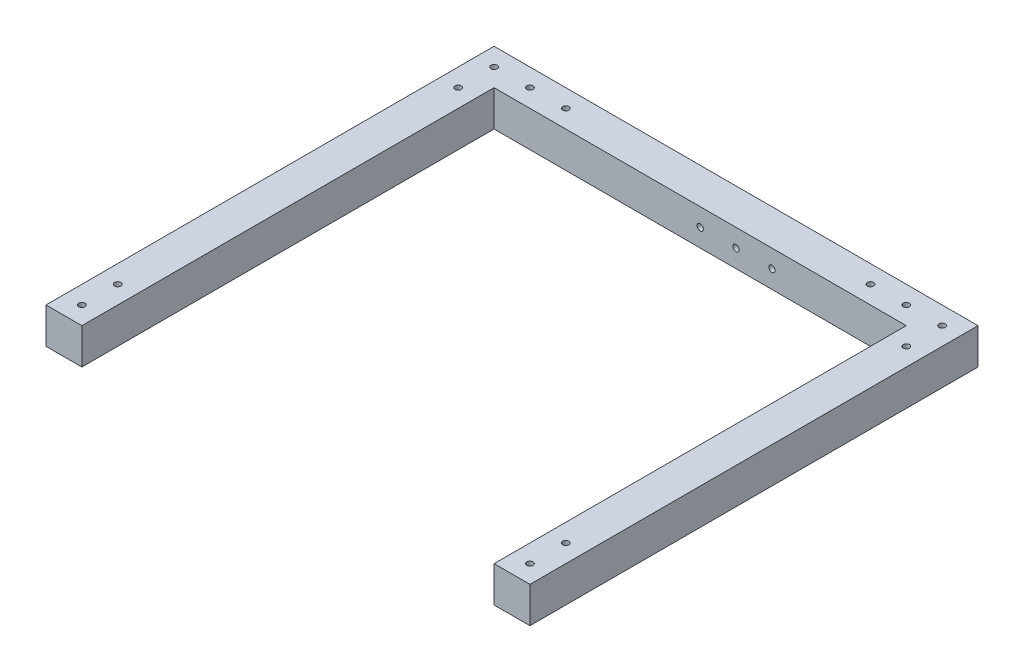
ISO-10303-21;
HEADER;
FILE_DESCRIPTION(('STEP AP214'),'2;1');
FILE_NAME('part.step','',(''),(''),'','','');
FILE_SCHEMA(('AUTOMOTIVE_DESIGN { 1 0 10303 214 1 1 1 1 }'));
ENDSEC;
DATA;
#1=APPLICATION_CONTEXT('core data for automotive mechanical design processes');
#2=APPLICATION_PROTOCOL_DEFINITION('international standard','automotive_design',2000,#1);
#3=PRODUCT_CONTEXT('',#1,'mechanical');
#4=PRODUCT('Part','Part','',(#3));
#5=PRODUCT_RELATED_PRODUCT_CATEGORY('part','',(#4));
#6=PRODUCT_DEFINITION_FORMATION('','',#4);
#7=PRODUCT_DEFINITION_CONTEXT('part definition',#1,'design');
#8=PRODUCT_DEFINITION('design','',#6,#7);
#9=PRODUCT_DEFINITION_SHAPE('','',#8);
#10=(LENGTH_UNIT() NAMED_UNIT(*) SI_UNIT(.MILLI.,.METRE.));
#11=(NAMED_UNIT(*) PLANE_ANGLE_UNIT() SI_UNIT($,.RADIAN.));
#12=(NAMED_UNIT(*) SI_UNIT($,.STERADIAN.) SOLID_ANGLE_UNIT());
#13=UNCERTAINTY_MEASURE_WITH_UNIT(LENGTH_MEASURE(1.E-05),#10,'distance_accuracy_value','');
#14=(GEOMETRIC_REPRESENTATION_CONTEXT(3) GLOBAL_UNCERTAINTY_ASSIGNED_CONTEXT((#13)) GLOBAL_UNIT_ASSIGNED_CONTEXT((#10,
#11,#12)) REPRESENTATION_CONTEXT('',''));
#15=CARTESIAN_POINT('',(0.,0.,0.));
#16=DIRECTION('',(0.,0.,1.));
#17=DIRECTION('',(1.,0.,0.));
#18=AXIS2_PLACEMENT_3D('',#15,#16,#17);
#19=CARTESIAN_POINT('',(0.,20.,0.));
#20=DIRECTION('',(0.,1.,0.));
#21=DIRECTION('',(0.,0.,1.));
#22=AXIS2_PLACEMENT_3D('',#19,#20,#21);
#23=PLANE('',#22);
#24=CARTESIAN_POINT('',(-125.,20.,20.));
#25=DIRECTION('',(0.,1.,0.));
#26=DIRECTION('',(0.,0.,1.));
#27=AXIS2_PLACEMENT_3D('',#24,#25,#26);
#28=CIRCLE('',#27,1.75000000000001);
#29=CARTESIAN_POINT('',(-125.,20.,21.75));
#30=VERTEX_POINT('',#29);
#31=EDGE_CURVE('E338',#30,#30,#28,.T.);
#32=ORIENTED_EDGE('',*,*,#31,.F.);
#33=EDGE_LOOP('',(#32));
#34=FACE_BOUND('',#33,.T.);
#35=CARTESIAN_POINT('',(-105.,20.,0.));
#36=DIRECTION('',(0.,1.,0.));
#37=DIRECTION('',(0.,0.,1.));
#38=AXIS2_PLACEMENT_3D('',#35,#36,#37);
#39=CIRCLE('',#38,1.75);
#40=CARTESIAN_POINT('',(-105.,20.,1.74999999999999));
#41=VERTEX_POINT('',#40);
#42=EDGE_CURVE('E337',#41,#41,#39,.T.);
#43=ORIENTED_EDGE('',*,*,#42,.F.);
#44=EDGE_LOOP('',(#43));
#45=FACE_BOUND('',#44,.T.);
#46=CARTESIAN_POINT('',(-125.,20.,210.));
#47=DIRECTION('',(0.,1.,0.));
#48=DIRECTION('',(0.,0.,1.));
#49=AXIS2_PLACEMENT_3D('',#46,#47,#48);
#50=CIRCLE('',#49,1.75000000000001);
#51=CARTESIAN_POINT('',(-125.,20.,211.75));
#52=VERTEX_POINT('',#51);
#53=EDGE_CURVE('E349',#52,#52,#50,.T.);
#54=ORIENTED_EDGE('',*,*,#53,.F.);
#55=EDGE_LOOP('',(#54));
#56=FACE_BOUND('',#55,.T.);
#57=CARTESIAN_POINT('',(-125.,20.,230.));
#58=DIRECTION('',(0.,1.,0.));
#59=DIRECTION('',(0.,0.,1.));
#60=AXIS2_PLACEMENT_3D('',#57,#58,#59);
#61=CIRCLE('',#60,1.75000000000001);
#62=CARTESIAN_POINT('',(-125.,20.,231.75));
#63=VERTEX_POINT('',#62);
#64=EDGE_CURVE('E360',#63,#63,#61,.T.);
#65=ORIENTED_EDGE('',*,*,#64,.F.);
#66=EDGE_LOOP('',(#65));
#67=FACE_BOUND('',#66,.T.);
#68=CARTESIAN_POINT('',(125.,20.,230.));
#69=DIRECTION('',(0.,1.,0.));
#70=DIRECTION('',(0.,0.,1.));
#71=AXIS2_PLACEMENT_3D('',#68,#69,#70);
#72=CIRCLE('',#71,1.75000000000001);
#73=CARTESIAN_POINT('',(125.,20.,231.75));
#74=VERTEX_POINT('',#73);
#75=EDGE_CURVE('E379',#74,#74,#72,.F.);
#76=ORIENTED_EDGE('',*,*,#75,.T.);
#77=EDGE_LOOP('',(#76));
#78=FACE_BOUND('',#77,.T.);
#79=CARTESIAN_POINT('',(125.,20.,20.));
#80=DIRECTION('',(0.,1.,0.));
#81=DIRECTION('',(0.,0.,1.));
#82=AXIS2_PLACEMENT_3D('',#79,#80,#81);
#83=CIRCLE('',#82,1.75000000000001);
#84=CARTESIAN_POINT('',(125.,20.,21.75));
#85=VERTEX_POINT('',#84);
#86=EDGE_CURVE('E312',#85,#85,#83,.F.);
#87=ORIENTED_EDGE('',*,*,#86,.T.);
#88=EDGE_LOOP('',(#87));
#89=FACE_BOUND('',#88,.T.);
#90=CARTESIAN_POINT('',(85.0000000000001,20.,0.));
#91=DIRECTION('',(0.,1.,0.));
#92=DIRECTION('',(0.,0.,1.));
#93=AXIS2_PLACEMENT_3D('',#90,#91,#92);
#94=CIRCLE('',#93,1.75);
#95=CARTESIAN_POINT('',(85.0000000000001,20.,1.74999999999997));
#96=VERTEX_POINT('',#95);
#97=EDGE_CURVE('E322',#96,#96,#94,.F.);
#98=ORIENTED_EDGE('',*,*,#97,.T.);
#99=EDGE_LOOP('',(#98));
#100=FACE_BOUND('',#99,.T.);
#101=CARTESIAN_POINT('',(-85.0000000000001,20.,0.));
#102=DIRECTION('',(0.,1.,0.));
#103=DIRECTION('',(0.,0.,1.));
#104=AXIS2_PLACEMENT_3D('',#101,#102,#103);
#105=CIRCLE('',#104,1.75);
#106=CARTESIAN_POINT('',(-85.0000000000001,20.,1.74999999999999));
#107=VERTEX_POINT('',#106);
#108=EDGE_CURVE('E327',#107,#107,#105,.T.);
#109=ORIENTED_EDGE('',*,*,#108,.F.);
#110=EDGE_LOOP('',(#109));
#111=FACE_BOUND('',#110,.T.);
#112=CARTESIAN_POINT('',(-125.,20.,0.));
#113=DIRECTION('',(0.,1.,0.));
#114=DIRECTION('',(0.,0.,1.));
#115=AXIS2_PLACEMENT_3D('',#112,#113,#114);
#116=CIRCLE('',#115,1.75000000000001);
#117=CARTESIAN_POINT('',(-125.,20.,1.75));
#118=VERTEX_POINT('',#117);
#119=EDGE_CURVE('E342',#118,#118,#116,.T.);
#120=ORIENTED_EDGE('',*,*,#119,.F.);
#121=EDGE_LOOP('',(#120));
#122=FACE_BOUND('',#121,.T.);
#123=DIRECTION('',(0.,0.,1.));
#124=VECTOR('',#123,1.);
#125=CARTESIAN_POINT('',(135.,20.,-3.7470027081099E-13));
#126=LINE('',#125,#124);
#127=CARTESIAN_POINT('',(135.,20.,-10.));
#128=VERTEX_POINT('',#127);
#129=CARTESIAN_POINT('',(135.,20.,240.));
#130=VERTEX_POINT('',#129);
#131=EDGE_CURVE('E171',#128,#130,#126,.T.);
#132=ORIENTED_EDGE('',*,*,#131,.F.);
#133=DIRECTION('',(1.,0.,0.));
#134=VECTOR('',#133,1.);
#135=CARTESIAN_POINT('',(0.,20.,-10.));
#136=LINE('',#135,#134);
#137=CARTESIAN_POINT('',(-135.,20.,-10.));
#138=VERTEX_POINT('',#137);
#139=EDGE_CURVE('E203',#138,#128,#136,.T.);
#140=ORIENTED_EDGE('',*,*,#139,.F.);
#141=DIRECTION('',(0.,0.,1.));
#142=VECTOR('',#141,1.);
#143=CARTESIAN_POINT('',(-135.,20.,0.));
#144=LINE('',#143,#142);
#145=CARTESIAN_POINT('',(-135.,20.,240.));
#146=VERTEX_POINT('',#145);
#147=EDGE_CURVE('E193',#138,#146,#144,.T.);
#148=ORIENTED_EDGE('',*,*,#147,.T.);
#149=DIRECTION('',(1.,0.,0.));
#150=VECTOR('',#149,1.);
#151=CARTESIAN_POINT('',(0.,20.,240.));
#152=LINE('',#151,#150);
#153=CARTESIAN_POINT('',(-115.,20.,240.));
#154=VERTEX_POINT('',#153);
#155=EDGE_CURVE('E413',#146,#154,#152,.T.);
#156=ORIENTED_EDGE('',*,*,#155,.T.);
#157=DIRECTION('',(0.,0.,1.));
#158=VECTOR('',#157,1.);
#159=CARTESIAN_POINT('',(-115.,20.,0.));
#160=LINE('',#159,#158);
#161=CARTESIAN_POINT('',(-115.,20.,10.));
#162=VERTEX_POINT('',#161);
#163=EDGE_CURVE('E125',#162,#154,#160,.T.);
#164=ORIENTED_EDGE('',*,*,#163,.F.);
#165=DIRECTION('',(1.,0.,0.));
#166=VECTOR('',#165,1.);
#167=CARTESIAN_POINT('',(0.,20.,10.));
#168=LINE('',#167,#166);
#169=CARTESIAN_POINT('',(115.,20.,9.99999999999999));
#170=VERTEX_POINT('',#169);
#171=EDGE_CURVE('E113',#162,#170,#168,.T.);
#172=ORIENTED_EDGE('',*,*,#171,.T.);
#173=DIRECTION('',(0.,0.,1.));
#174=VECTOR('',#173,1.);
#175=CARTESIAN_POINT('',(115.,20.,0.));
#176=LINE('',#175,#174);
#177=CARTESIAN_POINT('',(115.,20.,240.));
#178=VERTEX_POINT('',#177);
#179=EDGE_CURVE('E117',#170,#178,#176,.T.);
#180=ORIENTED_EDGE('',*,*,#179,.T.);
#181=DIRECTION('',(-1.,0.,0.));
#182=VECTOR('',#181,1.);
#183=CARTESIAN_POINT('',(-3.33066907387547E-13,20.,240.));
#184=LINE('',#183,#182);
#185=EDGE_CURVE('E136',#130,#178,#184,.T.);
#186=ORIENTED_EDGE('',*,*,#185,.F.);
#187=EDGE_LOOP('',(#132,#140,#148,#156,#164,#172,#180,#186));
#188=FACE_BOUND('',#187,.T.);
#189=CARTESIAN_POINT('',(105.,20.,0.));
#190=DIRECTION('',(0.,1.,0.));
#191=DIRECTION('',(0.,0.,1.));
#192=AXIS2_PLACEMENT_3D('',#189,#190,#191);
#193=CIRCLE('',#192,1.75);
#194=CARTESIAN_POINT('',(105.,20.,1.74999999999996));
#195=VERTEX_POINT('',#194);
#196=EDGE_CURVE('E316',#195,#195,#193,.F.);
#197=ORIENTED_EDGE('',*,*,#196,.T.);
#198=EDGE_LOOP('',(#197));
#199=FACE_BOUND('',#198,.T.);
#200=CARTESIAN_POINT('',(125.,20.,0.));
#201=DIRECTION('',(0.,1.,0.));
#202=DIRECTION('',(0.,0.,1.));
#203=AXIS2_PLACEMENT_3D('',#200,#201,#202);
#204=CIRCLE('',#203,1.75000000000001);
#205=CARTESIAN_POINT('',(125.,20.,1.74999999999997));
#206=VERTEX_POINT('',#205);
#207=EDGE_CURVE('E389',#206,#206,#204,.F.);
#208=ORIENTED_EDGE('',*,*,#207,.T.);
#209=EDGE_LOOP('',(#208));
#210=FACE_BOUND('',#209,.T.);
#211=CARTESIAN_POINT('',(125.,20.,210.));
#212=DIRECTION('',(0.,1.,0.));
#213=DIRECTION('',(0.,0.,1.));
#214=AXIS2_PLACEMENT_3D('',#211,#212,#213);
#215=CIRCLE('',#214,1.75000000000001);
#216=CARTESIAN_POINT('',(125.,20.,211.75));
#217=VERTEX_POINT('',#216);
#218=EDGE_CURVE('E375',#217,#217,#215,.F.);
#219=ORIENTED_EDGE('',*,*,#218,.T.);
#220=EDGE_LOOP('',(#219));
#221=FACE_BOUND('',#220,.T.);
#222=ADVANCED_FACE('F46',(#34,#45,#56,#67,#78,#89,#100,#111,#122,#188,#199,#210,#221),#23,.T.);
#223=CARTESIAN_POINT('',(0.,0.,0.));
#224=DIRECTION('',(0.,1.,0.));
#225=DIRECTION('',(0.,0.,1.));
#226=AXIS2_PLACEMENT_3D('',#223,#224,#225);
#227=PLANE('',#226);
#228=CARTESIAN_POINT('',(-125.,0.,20.));
#229=DIRECTION('',(0.,1.,0.));
#230=DIRECTION('',(0.,0.,1.));
#231=AXIS2_PLACEMENT_3D('',#228,#229,#230);
#232=CIRCLE('',#231,1.75000000000001);
#233=CARTESIAN_POINT('',(-125.,0.,21.75));
#234=VERTEX_POINT('',#233);
#235=EDGE_CURVE('E333',#234,#234,#232,.F.);
#236=ORIENTED_EDGE('',*,*,#235,.F.);
#237=EDGE_LOOP('',(#236));
#238=FACE_BOUND('',#237,.T.);
#239=CARTESIAN_POINT('',(-105.,0.,0.));
#240=DIRECTION('',(0.,1.,0.));
#241=DIRECTION('',(0.,0.,1.));
#242=AXIS2_PLACEMENT_3D('',#239,#240,#241);
#243=CIRCLE('',#242,1.75);
#244=CARTESIAN_POINT('',(-105.,0.,1.74999999999999));
#245=VERTEX_POINT('',#244);
#246=EDGE_CURVE('E344',#245,#245,#243,.F.);
#247=ORIENTED_EDGE('',*,*,#246,.F.);
#248=EDGE_LOOP('',(#247));
#249=FACE_BOUND('',#248,.T.);
#250=CARTESIAN_POINT('',(-125.,0.,210.));
#251=DIRECTION('',(0.,1.,0.));
#252=DIRECTION('',(0.,0.,1.));
#253=AXIS2_PLACEMENT_3D('',#250,#251,#252);
#254=CIRCLE('',#253,1.75000000000001);
#255=CARTESIAN_POINT('',(-125.,0.,211.75));
#256=VERTEX_POINT('',#255);
#257=EDGE_CURVE('E355',#256,#256,#254,.F.);
#258=ORIENTED_EDGE('',*,*,#257,.F.);
#259=EDGE_LOOP('',(#258));
#260=FACE_BOUND('',#259,.T.);
#261=CARTESIAN_POINT('',(-125.,0.,230.));
#262=DIRECTION('',(0.,1.,0.));
#263=DIRECTION('',(0.,0.,1.));
#264=AXIS2_PLACEMENT_3D('',#261,#262,#263);
#265=CIRCLE('',#264,1.75000000000001);
#266=CARTESIAN_POINT('',(-125.,0.,231.75));
#267=VERTEX_POINT('',#266);
#268=EDGE_CURVE('E363',#267,#267,#265,.F.);
#269=ORIENTED_EDGE('',*,*,#268,.F.);
#270=EDGE_LOOP('',(#269));
#271=FACE_BOUND('',#270,.T.);
#272=CARTESIAN_POINT('',(-85.0000000000001,0.,0.));
#273=DIRECTION('',(0.,1.,0.));
#274=DIRECTION('',(0.,0.,1.));
#275=AXIS2_PLACEMENT_3D('',#272,#273,#274);
#276=CIRCLE('',#275,1.75);
#277=CARTESIAN_POINT('',(-85.0000000000001,0.,1.74999999999999));
#278=VERTEX_POINT('',#277);
#279=EDGE_CURVE('E309',#278,#278,#276,.F.);
#280=ORIENTED_EDGE('',*,*,#279,.F.);
#281=EDGE_LOOP('',(#280));
#282=FACE_BOUND('',#281,.T.);
#283=CARTESIAN_POINT('',(-125.,0.,0.));
#284=DIRECTION('',(0.,1.,0.));
#285=DIRECTION('',(0.,0.,1.));
#286=AXIS2_PLACEMENT_3D('',#283,#284,#285);
#287=CIRCLE('',#286,1.75000000000001);
#288=CARTESIAN_POINT('',(-125.,0.,1.75));
#289=VERTEX_POINT('',#288);
#290=EDGE_CURVE('E146',#289,#289,#287,.F.);
#291=ORIENTED_EDGE('',*,*,#290,.F.);
#292=EDGE_LOOP('',(#291));
#293=FACE_BOUND('',#292,.T.);
#294=DIRECTION('',(0.,0.,1.));
#295=VECTOR('',#294,1.);
#296=CARTESIAN_POINT('',(135.,0.,-3.7470027081099E-13));
#297=LINE('',#296,#295);
#298=CARTESIAN_POINT('',(135.,0.,-10.));
#299=VERTEX_POINT('',#298);
#300=CARTESIAN_POINT('',(135.,0.,240.));
#301=VERTEX_POINT('',#300);
#302=EDGE_CURVE('E145',#299,#301,#297,.T.);
#303=ORIENTED_EDGE('',*,*,#302,.T.);
#304=DIRECTION('',(-1.,0.,0.));
#305=VECTOR('',#304,1.);
#306=CARTESIAN_POINT('',(-3.33066907387547E-13,0.,240.));
#307=LINE('',#306,#305);
#308=CARTESIAN_POINT('',(115.,0.,240.));
#309=VERTEX_POINT('',#308);
#310=EDGE_CURVE('E169',#301,#309,#307,.T.);
#311=ORIENTED_EDGE('',*,*,#310,.T.);
#312=DIRECTION('',(0.,0.,1.));
#313=VECTOR('',#312,1.);
#314=CARTESIAN_POINT('',(115.,0.,0.));
#315=LINE('',#314,#313);
#316=CARTESIAN_POINT('',(115.,0.,9.99999999999999));
#317=VERTEX_POINT('',#316);
#318=EDGE_CURVE('E164',#317,#309,#315,.T.);
#319=ORIENTED_EDGE('',*,*,#318,.F.);
#320=DIRECTION('',(1.,0.,0.));
#321=VECTOR('',#320,1.);
#322=CARTESIAN_POINT('',(0.,0.,10.));
#323=LINE('',#322,#321);
#324=CARTESIAN_POINT('',(-115.,0.,10.));
#325=VERTEX_POINT('',#324);
#326=EDGE_CURVE('E128',#325,#317,#323,.T.);
#327=ORIENTED_EDGE('',*,*,#326,.F.);
#328=DIRECTION('',(0.,0.,1.));
#329=VECTOR('',#328,1.);
#330=CARTESIAN_POINT('',(-115.,0.,0.));
#331=LINE('',#330,#329);
#332=CARTESIAN_POINT('',(-115.,0.,240.));
#333=VERTEX_POINT('',#332);
#334=EDGE_CURVE('E157',#325,#333,#331,.T.);
#335=ORIENTED_EDGE('',*,*,#334,.T.);
#336=DIRECTION('',(1.,0.,0.));
#337=VECTOR('',#336,1.);
#338=CARTESIAN_POINT('',(0.,0.,240.));
#339=LINE('',#338,#337);
#340=CARTESIAN_POINT('',(-135.,0.,240.));
#341=VERTEX_POINT('',#340);
#342=EDGE_CURVE('E154',#341,#333,#339,.T.);
#343=ORIENTED_EDGE('',*,*,#342,.F.);
#344=DIRECTION('',(0.,0.,1.));
#345=VECTOR('',#344,1.);
#346=CARTESIAN_POINT('',(-135.,0.,0.));
#347=LINE('',#346,#345);
#348=CARTESIAN_POINT('',(-135.,0.,-10.));
#349=VERTEX_POINT('',#348);
#350=EDGE_CURVE('E155',#349,#341,#347,.T.);
#351=ORIENTED_EDGE('',*,*,#350,.F.);
#352=DIRECTION('',(1.,0.,0.));
#353=VECTOR('',#352,1.);
#354=CARTESIAN_POINT('',(0.,0.,-10.));
#355=LINE('',#354,#353);
#356=EDGE_CURVE('E150',#349,#299,#355,.T.);
#357=ORIENTED_EDGE('',*,*,#356,.T.);
#358=EDGE_LOOP('',(#303,#311,#319,#327,#335,#343,#351,#357));
#359=FACE_BOUND('',#358,.T.);
#360=CARTESIAN_POINT('',(85.0000000000001,0.,0.));
#361=DIRECTION('',(0.,1.,0.));
#362=DIRECTION('',(0.,0.,1.));
#363=AXIS2_PLACEMENT_3D('',#360,#361,#362);
#364=CIRCLE('',#363,1.75);
#365=CARTESIAN_POINT('',(85.0000000000001,0.,1.74999999999997));
#366=VERTEX_POINT('',#365);
#367=EDGE_CURVE('E319',#366,#366,#364,.T.);
#368=ORIENTED_EDGE('',*,*,#367,.T.);
#369=EDGE_LOOP('',(#368));
#370=FACE_BOUND('',#369,.T.);
#371=CARTESIAN_POINT('',(105.,0.,0.));
#372=DIRECTION('',(0.,1.,0.));
#373=DIRECTION('',(0.,0.,1.));
#374=AXIS2_PLACEMENT_3D('',#371,#372,#373);
#375=CIRCLE('',#374,1.75);
#376=CARTESIAN_POINT('',(105.,0.,1.74999999999996));
#377=VERTEX_POINT('',#376);
#378=EDGE_CURVE('E313',#377,#377,#375,.T.);
#379=ORIENTED_EDGE('',*,*,#378,.T.);
#380=EDGE_LOOP('',(#379));
#381=FACE_BOUND('',#380,.T.);
#382=CARTESIAN_POINT('',(125.,0.,20.));
#383=DIRECTION('',(0.,1.,0.));
#384=DIRECTION('',(0.,0.,1.));
#385=AXIS2_PLACEMENT_3D('',#382,#383,#384);
#386=CIRCLE('',#385,1.75000000000001);
#387=CARTESIAN_POINT('',(125.,0.,21.75));
#388=VERTEX_POINT('',#387);
#389=EDGE_CURVE('E391',#388,#388,#386,.T.);
#390=ORIENTED_EDGE('',*,*,#389,.T.);
#391=EDGE_LOOP('',(#390));
#392=FACE_BOUND('',#391,.T.);
#393=CARTESIAN_POINT('',(125.,0.,0.));
#394=DIRECTION('',(0.,1.,0.));
#395=DIRECTION('',(0.,0.,1.));
#396=AXIS2_PLACEMENT_3D('',#393,#394,#395);
#397=CIRCLE('',#396,1.75000000000001);
#398=CARTESIAN_POINT('',(125.,0.,1.74999999999997));
#399=VERTEX_POINT('',#398);
#400=EDGE_CURVE('E383',#399,#399,#397,.T.);
#401=ORIENTED_EDGE('',*,*,#400,.T.);
#402=EDGE_LOOP('',(#401));
#403=FACE_BOUND('',#402,.T.);
#404=CARTESIAN_POINT('',(125.,0.,230.));
#405=DIRECTION('',(0.,1.,0.));
#406=DIRECTION('',(0.,0.,1.));
#407=AXIS2_PLACEMENT_3D('',#404,#405,#406);
#408=CIRCLE('',#407,1.75000000000001);
#409=CARTESIAN_POINT('',(125.,0.,231.75));
#410=VERTEX_POINT('',#409);
#411=EDGE_CURVE('E376',#410,#410,#408,.T.);
#412=ORIENTED_EDGE('',*,*,#411,.T.);
#413=EDGE_LOOP('',(#412));
#414=FACE_BOUND('',#413,.T.);
#415=CARTESIAN_POINT('',(125.,0.,210.));
#416=DIRECTION('',(0.,1.,0.));
#417=DIRECTION('',(0.,0.,1.));
#418=AXIS2_PLACEMENT_3D('',#415,#416,#417);
#419=CIRCLE('',#418,1.75000000000001);
#420=CARTESIAN_POINT('',(125.,0.,211.75));
#421=VERTEX_POINT('',#420);
#422=EDGE_CURVE('E364',#421,#421,#419,.T.);
#423=ORIENTED_EDGE('',*,*,#422,.T.);
#424=EDGE_LOOP('',(#423));
#425=FACE_BOUND('',#424,.T.);
#426=ADVANCED_FACE('F196',(#238,#249,#260,#271,#282,#293,#359,#370,#381,#392,#403,#414,#425),
#227,.F.);
#427=CARTESIAN_POINT('',(135.,20.,-3.7470027081099E-13));
#428=DIRECTION('',(1.,0.,0.));
#429=DIRECTION('',(0.,0.,-1.));
#430=AXIS2_PLACEMENT_3D('',#427,#428,#429);
#431=PLANE('',#430);
#432=ORIENTED_EDGE('',*,*,#302,.F.);
#433=DIRECTION('',(0.,-1.,0.));
#434=VECTOR('',#433,1.);
#435=CARTESIAN_POINT('',(135.,20.,-10.));
#436=LINE('',#435,#434);
#437=EDGE_CURVE('E11',#128,#299,#436,.T.);
#438=ORIENTED_EDGE('',*,*,#437,.F.);
#439=ORIENTED_EDGE('',*,*,#131,.T.);
#440=DIRECTION('',(0.,-1.,0.));
#441=VECTOR('',#440,1.);
#442=CARTESIAN_POINT('',(135.,20.,240.));
#443=LINE('',#442,#441);
#444=EDGE_CURVE('E63',#130,#301,#443,.T.);
#445=ORIENTED_EDGE('',*,*,#444,.T.);
#446=EDGE_LOOP('',(#432,#438,#439,#445));
#447=FACE_BOUND('',#446,.T.);
#448=ADVANCED_FACE('F48',(#447),#431,.T.);
#449=CARTESIAN_POINT('',(0.,20.,-10.));
#450=DIRECTION('',(0.,0.,-1.));
#451=DIRECTION('',(-1.,0.,0.));
#452=AXIS2_PLACEMENT_3D('',#449,#450,#451);
#453=PLANE('',#452);
#454=CARTESIAN_POINT('',(40.,10.,-10.));
#455=DIRECTION('',(0.,0.,-1.));
#456=DIRECTION('',(-1.,0.,0.));
#457=AXIS2_PLACEMENT_3D('',#454,#455,#456);
#458=CIRCLE('',#457,1.75);
#459=CARTESIAN_POINT('',(38.25,10.,-10.));
#460=VERTEX_POINT('',#459);
#461=EDGE_CURVE('E289',#460,#460,#458,.T.);
#462=ORIENTED_EDGE('',*,*,#461,.F.);
#463=EDGE_LOOP('',(#462));
#464=FACE_BOUND('',#463,.T.);
#465=CARTESIAN_POINT('',(0.,10.,-10.));
#466=DIRECTION('',(0.,0.,-1.));
#467=DIRECTION('',(-1.,0.,0.));
#468=AXIS2_PLACEMENT_3D('',#465,#466,#467);
#469=CIRCLE('',#468,1.75);
#470=CARTESIAN_POINT('',(-1.75,10.,-10.));
#471=VERTEX_POINT('',#470);
#472=EDGE_CURVE('E283',#471,#471,#469,.T.);
#473=ORIENTED_EDGE('',*,*,#472,.F.);
#474=EDGE_LOOP('',(#473));
#475=FACE_BOUND('',#474,.T.);
#476=CARTESIAN_POINT('',(20.,10.,-10.));
#477=DIRECTION('',(0.,0.,-1.));
#478=DIRECTION('',(-1.,0.,0.));
#479=AXIS2_PLACEMENT_3D('',#476,#477,#478);
#480=CIRCLE('',#479,1.75);
#481=CARTESIAN_POINT('',(18.25,10.,-10.));
#482=VERTEX_POINT('',#481);
#483=EDGE_CURVE('E294',#482,#482,#480,.T.);
#484=ORIENTED_EDGE('',*,*,#483,.F.);
#485=EDGE_LOOP('',(#484));
#486=FACE_BOUND('',#485,.T.);
#487=ORIENTED_EDGE('',*,*,#356,.F.);
#488=DIRECTION('',(0.,-1.,0.));
#489=VECTOR('',#488,1.);
#490=CARTESIAN_POINT('',(-135.,20.,-10.));
#491=LINE('',#490,#489);
#492=EDGE_CURVE('E57',#138,#349,#491,.T.);
#493=ORIENTED_EDGE('',*,*,#492,.F.);
#494=ORIENTED_EDGE('',*,*,#139,.T.);
#495=ORIENTED_EDGE('',*,*,#437,.T.);
#496=EDGE_LOOP('',(#487,#493,#494,#495));
#497=FACE_BOUND('',#496,.T.);
#498=ADVANCED_FACE('F199',(#464,#475,#486,#497),#453,.T.);
#499=CARTESIAN_POINT('',(-135.,20.,0.));
#500=DIRECTION('',(1.,0.,0.));
#501=DIRECTION('',(0.,0.,-1.));
#502=AXIS2_PLACEMENT_3D('',#499,#500,#501);
#503=PLANE('',#502);
#504=ORIENTED_EDGE('',*,*,#350,.T.);
#505=DIRECTION('',(0.,-1.,0.));
#506=VECTOR('',#505,1.);
#507=CARTESIAN_POINT('',(-135.,20.,240.));
#508=LINE('',#507,#506);
#509=EDGE_CURVE('E185',#146,#341,#508,.T.);
#510=ORIENTED_EDGE('',*,*,#509,.F.);
#511=ORIENTED_EDGE('',*,*,#147,.F.);
#512=ORIENTED_EDGE('',*,*,#492,.T.);
#513=EDGE_LOOP('',(#504,#510,#511,#512));
#514=FACE_BOUND('',#513,.T.);
#515=ADVANCED_FACE('F188',(#514),#503,.F.);
#516=CARTESIAN_POINT('',(0.,20.,240.));
#517=DIRECTION('',(0.,0.,-1.));
#518=DIRECTION('',(-1.,0.,0.));
#519=AXIS2_PLACEMENT_3D('',#516,#517,#518);
#520=PLANE('',#519);
#521=ORIENTED_EDGE('',*,*,#342,.T.);
#522=DIRECTION('',(0.,-1.,0.));
#523=VECTOR('',#522,1.);
#524=CARTESIAN_POINT('',(-115.,20.,240.));
#525=LINE('',#524,#523);
#526=EDGE_CURVE('E177',#154,#333,#525,.T.);
#527=ORIENTED_EDGE('',*,*,#526,.F.);
#528=ORIENTED_EDGE('',*,*,#155,.F.);
#529=ORIENTED_EDGE('',*,*,#509,.T.);
#530=EDGE_LOOP('',(#521,#527,#528,#529));
#531=FACE_BOUND('',#530,.T.);
#532=ADVANCED_FACE('F419',(#531),#520,.F.);
#533=CARTESIAN_POINT('',(-115.,20.,0.));
#534=DIRECTION('',(1.,0.,0.));
#535=DIRECTION('',(0.,0.,-1.));
#536=AXIS2_PLACEMENT_3D('',#533,#534,#535);
#537=PLANE('',#536);
#538=ORIENTED_EDGE('',*,*,#334,.F.);
#539=DIRECTION('',(0.,-1.,0.));
#540=VECTOR('',#539,1.);
#541=CARTESIAN_POINT('',(-115.,20.,10.));
#542=LINE('',#541,#540);
#543=EDGE_CURVE('E133',#162,#325,#542,.T.);
#544=ORIENTED_EDGE('',*,*,#543,.F.);
#545=ORIENTED_EDGE('',*,*,#163,.T.);
#546=ORIENTED_EDGE('',*,*,#526,.T.);
#547=EDGE_LOOP('',(#538,#544,#545,#546));
#548=FACE_BOUND('',#547,.T.);
#549=ADVANCED_FACE('F418',(#548),#537,.T.);
#550=CARTESIAN_POINT('',(0.,20.,10.));
#551=DIRECTION('',(0.,0.,-1.));
#552=DIRECTION('',(-1.,0.,0.));
#553=AXIS2_PLACEMENT_3D('',#550,#551,#552);
#554=PLANE('',#553);
#555=CARTESIAN_POINT('',(40.,10.,10.));
#556=DIRECTION('',(0.,0.,-1.));
#557=DIRECTION('',(-1.,0.,0.));
#558=AXIS2_PLACEMENT_3D('',#555,#556,#557);
#559=CIRCLE('',#558,1.75);
#560=CARTESIAN_POINT('',(38.25,10.,10.));
#561=VERTEX_POINT('',#560);
#562=EDGE_CURVE('E296',#561,#561,#559,.F.);
#563=ORIENTED_EDGE('',*,*,#562,.F.);
#564=EDGE_LOOP('',(#563));
#565=FACE_BOUND('',#564,.T.);
#566=CARTESIAN_POINT('',(0.,10.,10.));
#567=DIRECTION('',(0.,0.,-1.));
#568=DIRECTION('',(-1.,0.,0.));
#569=AXIS2_PLACEMENT_3D('',#566,#567,#568);
#570=CIRCLE('',#569,1.75);
#571=CARTESIAN_POINT('',(-1.75,10.,10.));
#572=VERTEX_POINT('',#571);
#573=EDGE_CURVE('E290',#572,#572,#570,.F.);
#574=ORIENTED_EDGE('',*,*,#573,.F.);
#575=EDGE_LOOP('',(#574));
#576=FACE_BOUND('',#575,.T.);
#577=CARTESIAN_POINT('',(20.,10.,10.));
#578=DIRECTION('',(0.,0.,-1.));
#579=DIRECTION('',(-1.,0.,0.));
#580=AXIS2_PLACEMENT_3D('',#577,#578,#579);
#581=CIRCLE('',#580,1.75);
#582=CARTESIAN_POINT('',(18.25,10.,10.));
#583=VERTEX_POINT('',#582);
#584=EDGE_CURVE('E308',#583,#583,#581,.F.);
#585=ORIENTED_EDGE('',*,*,#584,.F.);
#586=EDGE_LOOP('',(#585));
#587=FACE_BOUND('',#586,.T.);
#588=ORIENTED_EDGE('',*,*,#326,.T.);
#589=DIRECTION('',(0.,-1.,0.));
#590=VECTOR('',#589,1.);
#591=CARTESIAN_POINT('',(115.,20.,9.99999999999999));
#592=LINE('',#591,#590);
#593=EDGE_CURVE('E130',#170,#317,#592,.T.);
#594=ORIENTED_EDGE('',*,*,#593,.F.);
#595=ORIENTED_EDGE('',*,*,#171,.F.);
#596=ORIENTED_EDGE('',*,*,#543,.T.);
#597=EDGE_LOOP('',(#588,#594,#595,#596));
#598=FACE_BOUND('',#597,.T.);
#599=ADVANCED_FACE('F126',(#565,#576,#587,#598),#554,.F.);
#600=CARTESIAN_POINT('',(115.,20.,0.));
#601=DIRECTION('',(1.,0.,0.));
#602=DIRECTION('',(0.,0.,-1.));
#603=AXIS2_PLACEMENT_3D('',#600,#601,#602);
#604=PLANE('',#603);
#605=ORIENTED_EDGE('',*,*,#318,.T.);
#606=DIRECTION('',(0.,-1.,0.));
#607=VECTOR('',#606,1.);
#608=CARTESIAN_POINT('',(115.,20.,240.));
#609=LINE('',#608,#607);
#610=EDGE_CURVE('E89',#178,#309,#609,.T.);
#611=ORIENTED_EDGE('',*,*,#610,.F.);
#612=ORIENTED_EDGE('',*,*,#179,.F.);
#613=ORIENTED_EDGE('',*,*,#593,.T.);
#614=EDGE_LOOP('',(#605,#611,#612,#613));
#615=FACE_BOUND('',#614,.T.);
#616=ADVANCED_FACE('F138',(#615),#604,.F.);
#617=CARTESIAN_POINT('',(-3.33066907387547E-13,20.,240.));
#618=DIRECTION('',(0.,0.,1.));
#619=DIRECTION('',(1.,0.,0.));
#620=AXIS2_PLACEMENT_3D('',#617,#618,#619);
#621=PLANE('',#620);
#622=ORIENTED_EDGE('',*,*,#310,.F.);
#623=ORIENTED_EDGE('',*,*,#444,.F.);
#624=ORIENTED_EDGE('',*,*,#185,.T.);
#625=ORIENTED_EDGE('',*,*,#610,.T.);
#626=EDGE_LOOP('',(#622,#623,#624,#625));
#627=FACE_BOUND('',#626,.T.);
#628=ADVANCED_FACE('F205',(#627),#621,.T.);
#629=CARTESIAN_POINT('',(-125.,-0.001000000000001,0.));
#630=DIRECTION('',(0.,1.,0.));
#631=DIRECTION('',(0.,0.,1.));
#632=AXIS2_PLACEMENT_3D('',#629,#630,#631);
#633=CYLINDRICAL_SURFACE('',#632,1.75000000000001);
#634=ORIENTED_EDGE('',*,*,#119,.T.);
#635=EDGE_LOOP('',(#634));
#636=FACE_BOUND('',#635,.T.);
#637=ORIENTED_EDGE('',*,*,#290,.T.);
#638=EDGE_LOOP('',(#637));
#639=FACE_BOUND('',#638,.T.);
#640=ADVANCED_FACE('F204',(#636,#639),#633,.F.);
#641=CARTESIAN_POINT('',(-85.0000000000001,-0.001000000000001,0.));
#642=DIRECTION('',(0.,1.,0.));
#643=DIRECTION('',(0.,0.,1.));
#644=AXIS2_PLACEMENT_3D('',#641,#642,#643);
#645=CYLINDRICAL_SURFACE('',#644,1.75);
#646=ORIENTED_EDGE('',*,*,#108,.T.);
#647=EDGE_LOOP('',(#646));
#648=FACE_BOUND('',#647,.T.);
#649=ORIENTED_EDGE('',*,*,#279,.T.);
#650=EDGE_LOOP('',(#649));
#651=FACE_BOUND('',#650,.T.);
#652=ADVANCED_FACE('F211',(#648,#651),#645,.F.);
#653=CARTESIAN_POINT('',(85.0000000000001,-0.001000000000001,0.));
#654=DIRECTION('',(0.,1.,0.));
#655=DIRECTION('',(0.,0.,1.));
#656=AXIS2_PLACEMENT_3D('',#653,#654,#655);
#657=CYLINDRICAL_SURFACE('',#656,1.75);
#658=ORIENTED_EDGE('',*,*,#97,.F.);
#659=EDGE_LOOP('',(#658));
#660=FACE_BOUND('',#659,.T.);
#661=ORIENTED_EDGE('',*,*,#367,.F.);
#662=EDGE_LOOP('',(#661));
#663=FACE_BOUND('',#662,.T.);
#664=ADVANCED_FACE('F261',(#660,#663),#657,.F.);
#665=CARTESIAN_POINT('',(105.,-0.001000000000001,0.));
#666=DIRECTION('',(0.,1.,0.));
#667=DIRECTION('',(0.,0.,1.));
#668=AXIS2_PLACEMENT_3D('',#665,#666,#667);
#669=CYLINDRICAL_SURFACE('',#668,1.75);
#670=ORIENTED_EDGE('',*,*,#196,.F.);
#671=EDGE_LOOP('',(#670));
#672=FACE_BOUND('',#671,.T.);
#673=ORIENTED_EDGE('',*,*,#378,.F.);
#674=EDGE_LOOP('',(#673));
#675=FACE_BOUND('',#674,.T.);
#676=ADVANCED_FACE('F228',(#672,#675),#669,.F.);
#677=CARTESIAN_POINT('',(125.,-0.001000000000001,20.));
#678=DIRECTION('',(0.,1.,0.));
#679=DIRECTION('',(0.,0.,1.));
#680=AXIS2_PLACEMENT_3D('',#677,#678,#679);
#681=CYLINDRICAL_SURFACE('',#680,1.75000000000001);
#682=ORIENTED_EDGE('',*,*,#86,.F.);
#683=EDGE_LOOP('',(#682));
#684=FACE_BOUND('',#683,.T.);
#685=ORIENTED_EDGE('',*,*,#389,.F.);
#686=EDGE_LOOP('',(#685));
#687=FACE_BOUND('',#686,.T.);
#688=ADVANCED_FACE('F223',(#684,#687),#681,.F.);
#689=CARTESIAN_POINT('',(125.,-0.001000000000001,0.));
#690=DIRECTION('',(0.,1.,0.));
#691=DIRECTION('',(0.,0.,1.));
#692=AXIS2_PLACEMENT_3D('',#689,#690,#691);
#693=CYLINDRICAL_SURFACE('',#692,1.75000000000001);
#694=ORIENTED_EDGE('',*,*,#207,.F.);
#695=EDGE_LOOP('',(#694));
#696=FACE_BOUND('',#695,.T.);
#697=ORIENTED_EDGE('',*,*,#400,.F.);
#698=EDGE_LOOP('',(#697));
#699=FACE_BOUND('',#698,.T.);
#700=ADVANCED_FACE('F230',(#696,#699),#693,.F.);
#701=CARTESIAN_POINT('',(125.,-0.001000000000001,230.));
#702=DIRECTION('',(0.,1.,0.));
#703=DIRECTION('',(0.,0.,1.));
#704=AXIS2_PLACEMENT_3D('',#701,#702,#703);
#705=CYLINDRICAL_SURFACE('',#704,1.75000000000001);
#706=ORIENTED_EDGE('',*,*,#75,.F.);
#707=EDGE_LOOP('',(#706));
#708=FACE_BOUND('',#707,.T.);
#709=ORIENTED_EDGE('',*,*,#411,.F.);
#710=EDGE_LOOP('',(#709));
#711=FACE_BOUND('',#710,.T.);
#712=ADVANCED_FACE('F231',(#708,#711),#705,.F.);
#713=CARTESIAN_POINT('',(125.,-0.001000000000001,210.));
#714=DIRECTION('',(0.,1.,0.));
#715=DIRECTION('',(0.,0.,1.));
#716=AXIS2_PLACEMENT_3D('',#713,#714,#715);
#717=CYLINDRICAL_SURFACE('',#716,1.75000000000001);
#718=ORIENTED_EDGE('',*,*,#218,.F.);
#719=EDGE_LOOP('',(#718));
#720=FACE_BOUND('',#719,.T.);
#721=ORIENTED_EDGE('',*,*,#422,.F.);
#722=EDGE_LOOP('',(#721));
#723=FACE_BOUND('',#722,.T.);
#724=ADVANCED_FACE('F240',(#720,#723),#717,.F.);
#725=CARTESIAN_POINT('',(-125.,-0.001000000000001,230.));
#726=DIRECTION('',(0.,1.,0.));
#727=DIRECTION('',(0.,0.,1.));
#728=AXIS2_PLACEMENT_3D('',#725,#726,#727);
#729=CYLINDRICAL_SURFACE('',#728,1.75000000000001);
#730=ORIENTED_EDGE('',*,*,#64,.T.);
#731=EDGE_LOOP('',(#730));
#732=FACE_BOUND('',#731,.T.);
#733=ORIENTED_EDGE('',*,*,#268,.T.);
#734=EDGE_LOOP('',(#733));
#735=FACE_BOUND('',#734,.T.);
#736=ADVANCED_FACE('F244',(#732,#735),#729,.F.);
#737=CARTESIAN_POINT('',(-125.,-0.001000000000001,210.));
#738=DIRECTION('',(0.,1.,0.));
#739=DIRECTION('',(0.,0.,1.));
#740=AXIS2_PLACEMENT_3D('',#737,#738,#739);
#741=CYLINDRICAL_SURFACE('',#740,1.75000000000001);
#742=ORIENTED_EDGE('',*,*,#53,.T.);
#743=EDGE_LOOP('',(#742));
#744=FACE_BOUND('',#743,.T.);
#745=ORIENTED_EDGE('',*,*,#257,.T.);
#746=EDGE_LOOP('',(#745));
#747=FACE_BOUND('',#746,.T.);
#748=ADVANCED_FACE('F242',(#744,#747),#741,.F.);
#749=CARTESIAN_POINT('',(-105.,-0.001000000000001,0.));
#750=DIRECTION('',(0.,1.,0.));
#751=DIRECTION('',(0.,0.,1.));
#752=AXIS2_PLACEMENT_3D('',#749,#750,#751);
#753=CYLINDRICAL_SURFACE('',#752,1.75);
#754=ORIENTED_EDGE('',*,*,#42,.T.);
#755=EDGE_LOOP('',(#754));
#756=FACE_BOUND('',#755,.T.);
#757=ORIENTED_EDGE('',*,*,#246,.T.);
#758=EDGE_LOOP('',(#757));
#759=FACE_BOUND('',#758,.T.);
#760=ADVANCED_FACE('F247',(#756,#759),#753,.F.);
#761=CARTESIAN_POINT('',(-125.,-0.001000000000001,20.));
#762=DIRECTION('',(0.,1.,0.));
#763=DIRECTION('',(0.,0.,1.));
#764=AXIS2_PLACEMENT_3D('',#761,#762,#763);
#765=CYLINDRICAL_SURFACE('',#764,1.75000000000001);
#766=ORIENTED_EDGE('',*,*,#31,.T.);
#767=EDGE_LOOP('',(#766));
#768=FACE_BOUND('',#767,.T.);
#769=ORIENTED_EDGE('',*,*,#235,.T.);
#770=EDGE_LOOP('',(#769));
#771=FACE_BOUND('',#770,.T.);
#772=ADVANCED_FACE('F251',(#768,#771),#765,.F.);
#773=CARTESIAN_POINT('',(20.,10.,240.001));
#774=DIRECTION('',(0.,0.,-1.));
#775=DIRECTION('',(-1.,0.,0.));
#776=AXIS2_PLACEMENT_3D('',#773,#774,#775);
#777=CYLINDRICAL_SURFACE('',#776,1.75);
#778=ORIENTED_EDGE('',*,*,#483,.T.);
#779=EDGE_LOOP('',(#778));
#780=FACE_BOUND('',#779,.T.);
#781=ORIENTED_EDGE('',*,*,#584,.T.);
#782=EDGE_LOOP('',(#781));
#783=FACE_BOUND('',#782,.T.);
#784=ADVANCED_FACE('F260',(#780,#783),#777,.F.);
#785=CARTESIAN_POINT('',(0.,10.,240.001));
#786=DIRECTION('',(0.,0.,-1.));
#787=DIRECTION('',(-1.,0.,0.));
#788=AXIS2_PLACEMENT_3D('',#785,#786,#787);
#789=CYLINDRICAL_SURFACE('',#788,1.75);
#790=ORIENTED_EDGE('',*,*,#472,.T.);
#791=EDGE_LOOP('',(#790));
#792=FACE_BOUND('',#791,.T.);
#793=ORIENTED_EDGE('',*,*,#573,.T.);
#794=EDGE_LOOP('',(#793));
#795=FACE_BOUND('',#794,.T.);
#796=ADVANCED_FACE('F271',(#792,#795),#789,.F.);
#797=CARTESIAN_POINT('',(40.,10.,240.001));
#798=DIRECTION('',(0.,0.,-1.));
#799=DIRECTION('',(-1.,0.,0.));
#800=AXIS2_PLACEMENT_3D('',#797,#798,#799);
#801=CYLINDRICAL_SURFACE('',#800,1.75);
#802=ORIENTED_EDGE('',*,*,#461,.T.);
#803=EDGE_LOOP('',(#802));
#804=FACE_BOUND('',#803,.T.);
#805=ORIENTED_EDGE('',*,*,#562,.T.);
#806=EDGE_LOOP('',(#805));
#807=FACE_BOUND('',#806,.T.);
#808=ADVANCED_FACE('F272',(#804,#807),#801,.F.);
#809=CLOSED_SHELL('',(#222,#426,#448,#498,#515,#532,#549,#599,#616,#628,#640,#652,#664,#676,
#688,#700,#712,#724,#736,#748,#760,#772,#784,#796,#808));
#810=MANIFOLD_SOLID_BREP('B2',#809);
#811=ADVANCED_BREP_SHAPE_REPRESENTATION('',(#18,#810),#14);
#812=SHAPE_DEFINITION_REPRESENTATION(#9,#811);
ENDSEC;
END-ISO-10303-21;
